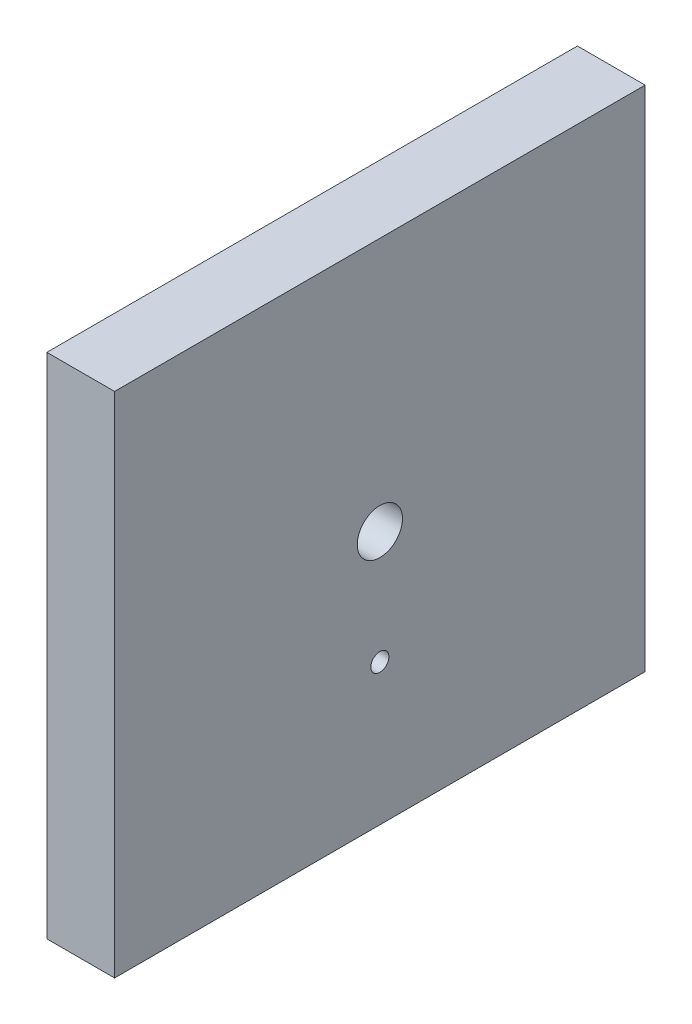
ISO-10303-21;
HEADER;
FILE_DESCRIPTION(('STEP AP214'),'2;1');
FILE_NAME('part.step','',(''),(''),'','','');
FILE_SCHEMA(('AUTOMOTIVE_DESIGN { 1 0 10303 214 1 1 1 1 }'));
ENDSEC;
DATA;
#1=APPLICATION_CONTEXT('core data for automotive mechanical design processes');
#2=APPLICATION_PROTOCOL_DEFINITION('international standard','automotive_design',2000,#1);
#3=PRODUCT_CONTEXT('',#1,'mechanical');
#4=PRODUCT('Part','Part','',(#3));
#5=PRODUCT_RELATED_PRODUCT_CATEGORY('part','',(#4));
#6=PRODUCT_DEFINITION_FORMATION('','',#4);
#7=PRODUCT_DEFINITION_CONTEXT('part definition',#1,'design');
#8=PRODUCT_DEFINITION('design','',#6,#7);
#9=PRODUCT_DEFINITION_SHAPE('','',#8);
#10=(LENGTH_UNIT() NAMED_UNIT(*) SI_UNIT(.MILLI.,.METRE.));
#11=(NAMED_UNIT(*) PLANE_ANGLE_UNIT() SI_UNIT($,.RADIAN.));
#12=(NAMED_UNIT(*) SI_UNIT($,.STERADIAN.) SOLID_ANGLE_UNIT());
#13=UNCERTAINTY_MEASURE_WITH_UNIT(LENGTH_MEASURE(1.E-05),#10,'distance_accuracy_value','');
#14=(GEOMETRIC_REPRESENTATION_CONTEXT(3) GLOBAL_UNCERTAINTY_ASSIGNED_CONTEXT((#13)) GLOBAL_UNIT_ASSIGNED_CONTEXT((#10,
#11,#12)) REPRESENTATION_CONTEXT('',''));
#15=CARTESIAN_POINT('',(0.,0.,0.));
#16=DIRECTION('',(0.,0.,1.));
#17=DIRECTION('',(1.,0.,0.));
#18=AXIS2_PLACEMENT_3D('',#15,#16,#17);
#19=CARTESIAN_POINT('',(12.,45.,47.));
#20=DIRECTION('',(0.,0.,-1.));
#21=DIRECTION('',(0.,1.,0.));
#22=AXIS2_PLACEMENT_3D('',#19,#20,#21);
#23=PLANE('',#22);
#24=DIRECTION('',(0.,-1.,0.));
#25=VECTOR('',#24,1.);
#26=CARTESIAN_POINT('',(0.,45.,47.));
#27=LINE('',#26,#25);
#28=CARTESIAN_POINT('',(0.,45.,47.));
#29=VERTEX_POINT('',#28);
#30=CARTESIAN_POINT('',(0.,-45.,47.));
#31=VERTEX_POINT('',#30);
#32=EDGE_CURVE('E97',#29,#31,#27,.T.);
#33=ORIENTED_EDGE('',*,*,#32,.T.);
#34=DIRECTION('',(-1.,0.,0.));
#35=VECTOR('',#34,1.);
#36=CARTESIAN_POINT('',(12.,-45.,47.));
#37=LINE('',#36,#35);
#38=CARTESIAN_POINT('',(12.,-45.,47.));
#39=VERTEX_POINT('',#38);
#40=EDGE_CURVE('E11',#39,#31,#37,.T.);
#41=ORIENTED_EDGE('',*,*,#40,.F.);
#42=DIRECTION('',(0.,-1.,0.));
#43=VECTOR('',#42,1.);
#44=CARTESIAN_POINT('',(12.,45.,47.));
#45=LINE('',#44,#43);
#46=CARTESIAN_POINT('',(12.,45.,47.));
#47=VERTEX_POINT('',#46);
#48=EDGE_CURVE('E85',#47,#39,#45,.T.);
#49=ORIENTED_EDGE('',*,*,#48,.F.);
#50=DIRECTION('',(-1.,0.,0.));
#51=VECTOR('',#50,1.);
#52=CARTESIAN_POINT('',(12.,45.,47.));
#53=LINE('',#52,#51);
#54=EDGE_CURVE('E93',#47,#29,#53,.T.);
#55=ORIENTED_EDGE('',*,*,#54,.T.);
#56=EDGE_LOOP('',(#33,#41,#49,#55));
#57=FACE_BOUND('',#56,.T.);
#58=ADVANCED_FACE('F34',(#57),#23,.F.);
#59=CARTESIAN_POINT('',(12.,-45.,47.));
#60=DIRECTION('',(0.,1.,0.));
#61=DIRECTION('',(0.,0.,1.));
#62=AXIS2_PLACEMENT_3D('',#59,#60,#61);
#63=PLANE('',#62);
#64=DIRECTION('',(0.,0.,-1.));
#65=VECTOR('',#64,1.);
#66=CARTESIAN_POINT('',(0.,-45.,47.));
#67=LINE('',#66,#65);
#68=CARTESIAN_POINT('',(0.,-45.,-47.));
#69=VERTEX_POINT('',#68);
#70=EDGE_CURVE('E89',#31,#69,#67,.T.);
#71=ORIENTED_EDGE('',*,*,#70,.T.);
#72=DIRECTION('',(-1.,0.,0.));
#73=VECTOR('',#72,1.);
#74=CARTESIAN_POINT('',(12.,-45.,-47.));
#75=LINE('',#74,#73);
#76=CARTESIAN_POINT('',(12.,-45.,-47.));
#77=VERTEX_POINT('',#76);
#78=EDGE_CURVE('E42',#77,#69,#75,.T.);
#79=ORIENTED_EDGE('',*,*,#78,.F.);
#80=DIRECTION('',(0.,0.,-1.));
#81=VECTOR('',#80,1.);
#82=CARTESIAN_POINT('',(12.,-45.,47.));
#83=LINE('',#82,#81);
#84=EDGE_CURVE('E80',#39,#77,#83,.T.);
#85=ORIENTED_EDGE('',*,*,#84,.F.);
#86=ORIENTED_EDGE('',*,*,#40,.T.);
#87=EDGE_LOOP('',(#71,#79,#85,#86));
#88=FACE_BOUND('',#87,.T.);
#89=ADVANCED_FACE('F88',(#88),#63,.F.);
#90=CARTESIAN_POINT('',(12.,45.,-47.));
#91=DIRECTION('',(0.,0.,1.));
#92=DIRECTION('',(0.,-1.,0.));
#93=AXIS2_PLACEMENT_3D('',#90,#91,#92);
#94=PLANE('',#93);
#95=DIRECTION('',(0.,1.,0.));
#96=VECTOR('',#95,1.);
#97=CARTESIAN_POINT('',(0.,45.,-47.));
#98=LINE('',#97,#96);
#99=CARTESIAN_POINT('',(0.,45.,-47.));
#100=VERTEX_POINT('',#99);
#101=EDGE_CURVE('E67',#69,#100,#98,.T.);
#102=ORIENTED_EDGE('',*,*,#101,.T.);
#103=DIRECTION('',(-1.,0.,0.));
#104=VECTOR('',#103,1.);
#105=CARTESIAN_POINT('',(12.,45.,-47.));
#106=LINE('',#105,#104);
#107=CARTESIAN_POINT('',(12.,45.,-47.));
#108=VERTEX_POINT('',#107);
#109=EDGE_CURVE('E90',#108,#100,#106,.T.);
#110=ORIENTED_EDGE('',*,*,#109,.F.);
#111=DIRECTION('',(0.,1.,0.));
#112=VECTOR('',#111,1.);
#113=CARTESIAN_POINT('',(12.,45.,-47.));
#114=LINE('',#113,#112);
#115=EDGE_CURVE('E83',#77,#108,#114,.T.);
#116=ORIENTED_EDGE('',*,*,#115,.F.);
#117=ORIENTED_EDGE('',*,*,#78,.T.);
#118=EDGE_LOOP('',(#102,#110,#116,#117));
#119=FACE_BOUND('',#118,.T.);
#120=ADVANCED_FACE('F91',(#119),#94,.F.);
#121=CARTESIAN_POINT('',(12.,45.,47.));
#122=DIRECTION('',(0.,-1.,0.));
#123=DIRECTION('',(0.,0.,-1.));
#124=AXIS2_PLACEMENT_3D('',#121,#122,#123);
#125=PLANE('',#124);
#126=DIRECTION('',(0.,0.,1.));
#127=VECTOR('',#126,1.);
#128=CARTESIAN_POINT('',(0.,45.,47.));
#129=LINE('',#128,#127);
#130=EDGE_CURVE('E73',#100,#29,#129,.T.);
#131=ORIENTED_EDGE('',*,*,#130,.T.);
#132=ORIENTED_EDGE('',*,*,#54,.F.);
#133=DIRECTION('',(0.,0.,1.));
#134=VECTOR('',#133,1.);
#135=CARTESIAN_POINT('',(12.,45.,47.));
#136=LINE('',#135,#134);
#137=EDGE_CURVE('E50',#108,#47,#136,.T.);
#138=ORIENTED_EDGE('',*,*,#137,.F.);
#139=ORIENTED_EDGE('',*,*,#109,.T.);
#140=EDGE_LOOP('',(#131,#132,#138,#139));
#141=FACE_BOUND('',#140,.T.);
#142=ADVANCED_FACE('F105',(#141),#125,.F.);
#143=CARTESIAN_POINT('',(12.,0.,0.));
#144=DIRECTION('',(1.,0.,0.));
#145=DIRECTION('',(0.,0.,-1.));
#146=AXIS2_PLACEMENT_3D('',#143,#144,#145);
#147=PLANE('',#146);
#148=CARTESIAN_POINT('',(12.,-20.,0.));
#149=DIRECTION('',(-1.,0.,0.));
#150=DIRECTION('',(0.,0.,1.));
#151=AXIS2_PLACEMENT_3D('',#148,#149,#150);
#152=CIRCLE('',#151,1.6);
#153=CARTESIAN_POINT('',(12.,-20.,1.6));
#154=VERTEX_POINT('',#153);
#155=EDGE_CURVE('E114',#154,#154,#152,.T.);
#156=ORIENTED_EDGE('',*,*,#155,.T.);
#157=EDGE_LOOP('',(#156));
#158=FACE_BOUND('',#157,.T.);
#159=CARTESIAN_POINT('',(12.,0.,0.));
#160=DIRECTION('',(1.,0.,0.));
#161=DIRECTION('',(0.,0.,-1.));
#162=AXIS2_PLACEMENT_3D('',#159,#160,#161);
#163=CIRCLE('',#162,4.);
#164=CARTESIAN_POINT('',(12.,0.,-4.));
#165=VERTEX_POINT('',#164);
#166=EDGE_CURVE('E111',#165,#165,#163,.T.);
#167=ORIENTED_EDGE('',*,*,#166,.F.);
#168=EDGE_LOOP('',(#167));
#169=FACE_BOUND('',#168,.T.);
#170=ORIENTED_EDGE('',*,*,#48,.T.);
#171=ORIENTED_EDGE('',*,*,#84,.T.);
#172=ORIENTED_EDGE('',*,*,#115,.T.);
#173=ORIENTED_EDGE('',*,*,#137,.T.);
#174=EDGE_LOOP('',(#170,#171,#172,#173));
#175=FACE_BOUND('',#174,.T.);
#176=ADVANCED_FACE('F81',(#158,#169,#175),#147,.T.);
#177=CARTESIAN_POINT('',(0.,0.,0.));
#178=DIRECTION('',(1.,0.,0.));
#179=DIRECTION('',(0.,0.,-1.));
#180=AXIS2_PLACEMENT_3D('',#177,#178,#179);
#181=PLANE('',#180);
#182=CARTESIAN_POINT('',(0.,-20.,0.));
#183=DIRECTION('',(-1.,0.,0.));
#184=DIRECTION('',(0.,0.,1.));
#185=AXIS2_PLACEMENT_3D('',#182,#183,#184);
#186=CIRCLE('',#185,1.6);
#187=CARTESIAN_POINT('',(0.,-20.,1.6));
#188=VERTEX_POINT('',#187);
#189=EDGE_CURVE('E117',#188,#188,#186,.T.);
#190=ORIENTED_EDGE('',*,*,#189,.F.);
#191=EDGE_LOOP('',(#190));
#192=FACE_BOUND('',#191,.T.);
#193=CARTESIAN_POINT('',(0.,0.,0.));
#194=DIRECTION('',(1.,0.,0.));
#195=DIRECTION('',(0.,0.,-1.));
#196=AXIS2_PLACEMENT_3D('',#193,#194,#195);
#197=CIRCLE('',#196,4.);
#198=CARTESIAN_POINT('',(0.,0.,-4.));
#199=VERTEX_POINT('',#198);
#200=EDGE_CURVE('E100',#199,#199,#197,.T.);
#201=ORIENTED_EDGE('',*,*,#200,.T.);
#202=EDGE_LOOP('',(#201));
#203=FACE_BOUND('',#202,.T.);
#204=ORIENTED_EDGE('',*,*,#32,.F.);
#205=ORIENTED_EDGE('',*,*,#130,.F.);
#206=ORIENTED_EDGE('',*,*,#101,.F.);
#207=ORIENTED_EDGE('',*,*,#70,.F.);
#208=EDGE_LOOP('',(#204,#205,#206,#207));
#209=FACE_BOUND('',#208,.T.);
#210=ADVANCED_FACE('F108',(#192,#203,#209),#181,.F.);
#211=CARTESIAN_POINT('',(0.,0.,0.));
#212=DIRECTION('',(1.,0.,0.));
#213=DIRECTION('',(0.,0.,-1.));
#214=AXIS2_PLACEMENT_3D('',#211,#212,#213);
#215=CYLINDRICAL_SURFACE('',#214,4.);
#216=ORIENTED_EDGE('',*,*,#200,.F.);
#217=EDGE_LOOP('',(#216));
#218=FACE_BOUND('',#217,.T.);
#219=ORIENTED_EDGE('',*,*,#166,.T.);
#220=EDGE_LOOP('',(#219));
#221=FACE_BOUND('',#220,.T.);
#222=ADVANCED_FACE('F128',(#218,#221),#215,.F.);
#223=CARTESIAN_POINT('',(12.,-20.,0.));
#224=DIRECTION('',(-1.,0.,0.));
#225=DIRECTION('',(0.,0.,1.));
#226=AXIS2_PLACEMENT_3D('',#223,#224,#225);
#227=CYLINDRICAL_SURFACE('',#226,1.6);
#228=ORIENTED_EDGE('',*,*,#155,.F.);
#229=EDGE_LOOP('',(#228));
#230=FACE_BOUND('',#229,.T.);
#231=ORIENTED_EDGE('',*,*,#189,.T.);
#232=EDGE_LOOP('',(#231));
#233=FACE_BOUND('',#232,.T.);
#234=ADVANCED_FACE('F125',(#230,#233),#227,.F.);
#235=CLOSED_SHELL('',(#58,#89,#120,#142,#176,#210,#222,#234));
#236=MANIFOLD_SOLID_BREP('B2',#235);
#237=ADVANCED_BREP_SHAPE_REPRESENTATION('',(#18,#236),#14);
#238=SHAPE_DEFINITION_REPRESENTATION(#9,#237);
ENDSEC;
END-ISO-10303-21;
